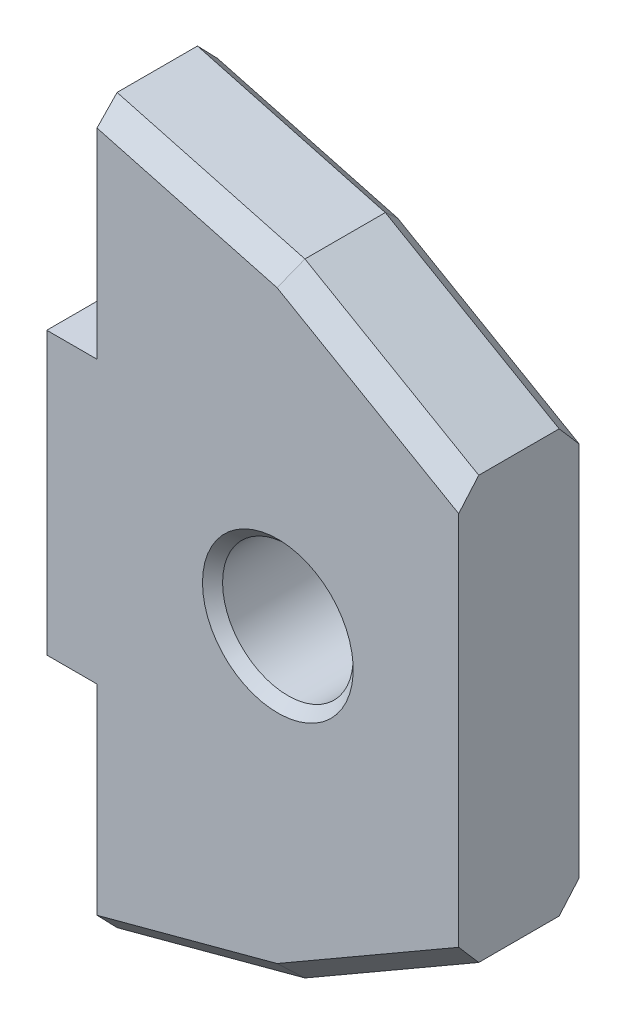
ISO-10303-21;
HEADER;
FILE_DESCRIPTION(('STEP AP214'),'2;1');
FILE_NAME('part.step','',(''),(''),'','','');
FILE_SCHEMA(('AUTOMOTIVE_DESIGN { 1 0 10303 214 1 1 1 1 }'));
ENDSEC;
DATA;
#1=APPLICATION_CONTEXT('core data for automotive mechanical design processes');
#2=APPLICATION_PROTOCOL_DEFINITION('international standard','automotive_design',2000,#1);
#3=PRODUCT_CONTEXT('',#1,'mechanical');
#4=PRODUCT('Part','Part','',(#3));
#5=PRODUCT_RELATED_PRODUCT_CATEGORY('part','',(#4));
#6=PRODUCT_DEFINITION_FORMATION('','',#4);
#7=PRODUCT_DEFINITION_CONTEXT('part definition',#1,'design');
#8=PRODUCT_DEFINITION('design','',#6,#7);
#9=PRODUCT_DEFINITION_SHAPE('','',#8);
#10=(LENGTH_UNIT() NAMED_UNIT(*) SI_UNIT(.MILLI.,.METRE.));
#11=(NAMED_UNIT(*) PLANE_ANGLE_UNIT() SI_UNIT($,.RADIAN.));
#12=(NAMED_UNIT(*) SI_UNIT($,.STERADIAN.) SOLID_ANGLE_UNIT());
#13=UNCERTAINTY_MEASURE_WITH_UNIT(LENGTH_MEASURE(1.E-05),#10,'distance_accuracy_value','');
#14=(GEOMETRIC_REPRESENTATION_CONTEXT(3) GLOBAL_UNCERTAINTY_ASSIGNED_CONTEXT((#13)) GLOBAL_UNIT_ASSIGNED_CONTEXT((#10,
#11,#12)) REPRESENTATION_CONTEXT('',''));
#15=CARTESIAN_POINT('',(0.,0.,0.));
#16=DIRECTION('',(0.,0.,1.));
#17=DIRECTION('',(1.,0.,0.));
#18=AXIS2_PLACEMENT_3D('',#15,#16,#17);
#19=CARTESIAN_POINT('',(-18.,14.,6.));
#20=DIRECTION('',(-1.,0.,0.));
#21=DIRECTION('',(0.,0.,1.));
#22=AXIS2_PLACEMENT_3D('',#19,#20,#21);
#23=PLANE('',#22);
#24=DIRECTION('',(0.,0.,-1.));
#25=VECTOR('',#24,1.);
#26=CARTESIAN_POINT('',(-18.,36.,6.));
#27=LINE('',#26,#25);
#28=CARTESIAN_POINT('',(-18.,36.,4.));
#29=VERTEX_POINT('',#28);
#30=CARTESIAN_POINT('',(-18.,36.,-3.99999999999997));
#31=VERTEX_POINT('',#30);
#32=EDGE_CURVE('E230',#29,#31,#27,.T.);
#33=ORIENTED_EDGE('',*,*,#32,.T.);
#34=DIRECTION('',(0.,0.719254596676402,0.694746590606868));
#35=VECTOR('',#34,1.);
#36=CARTESIAN_POINT('',(-18.,29.6157989417095,-10.1666646824248));
#37=LINE('',#36,#35);
#38=CARTESIAN_POINT('',(-18.,33.9294476391798,-6.));
#39=VERTEX_POINT('',#38);
#40=EDGE_CURVE('E309',#31,#39,#37,.F.);
#41=ORIENTED_EDGE('',*,*,#40,.T.);
#42=DIRECTION('',(0.,1.,0.));
#43=VECTOR('',#42,1.);
#44=CARTESIAN_POINT('',(-18.,14.,-6.));
#45=LINE('',#44,#43);
#46=CARTESIAN_POINT('',(-18.,14.,-6.));
#47=VERTEX_POINT('',#46);
#48=EDGE_CURVE('E231',#47,#39,#45,.T.);
#49=ORIENTED_EDGE('',*,*,#48,.F.);
#50=DIRECTION('',(0.,0.,-1.));
#51=VECTOR('',#50,1.);
#52=CARTESIAN_POINT('',(-18.,14.,6.));
#53=LINE('',#52,#51);
#54=CARTESIAN_POINT('',(-18.,14.,6.));
#55=VERTEX_POINT('',#54);
#56=EDGE_CURVE('E247',#55,#47,#53,.T.);
#57=ORIENTED_EDGE('',*,*,#56,.F.);
#58=DIRECTION('',(0.,1.,0.));
#59=VECTOR('',#58,1.);
#60=CARTESIAN_POINT('',(-18.,14.,6.));
#61=LINE('',#60,#59);
#62=CARTESIAN_POINT('',(-18.,33.9294476391798,6.));
#63=VERTEX_POINT('',#62);
#64=EDGE_CURVE('E222',#55,#63,#61,.T.);
#65=ORIENTED_EDGE('',*,*,#64,.T.);
#66=DIRECTION('',(0.,0.719254596676405,-0.694746590606864));
#67=VECTOR('',#66,1.);
#68=CARTESIAN_POINT('',(-18.,23.6194027958785,15.9587385843432));
#69=LINE('',#68,#67);
#70=EDGE_CURVE('E307',#63,#29,#69,.T.);
#71=ORIENTED_EDGE('',*,*,#70,.T.);
#72=EDGE_LOOP('',(#33,#41,#49,#57,#65,#71));
#73=FACE_BOUND('',#72,.T.);
#74=ADVANCED_FACE('F76',(#73),#23,.T.);
#75=CARTESIAN_POINT('',(-23.,14.,6.));
#76=DIRECTION('',(0.,1.,0.));
#77=DIRECTION('',(0.,0.,1.));
#78=AXIS2_PLACEMENT_3D('',#75,#76,#77);
#79=PLANE('',#78);
#80=DIRECTION('',(1.,0.,0.));
#81=VECTOR('',#80,1.);
#82=CARTESIAN_POINT('',(-23.,14.,-6.));
#83=LINE('',#82,#81);
#84=CARTESIAN_POINT('',(-23.,14.,-6.));
#85=VERTEX_POINT('',#84);
#86=EDGE_CURVE('E244',#85,#47,#83,.T.);
#87=ORIENTED_EDGE('',*,*,#86,.F.);
#88=DIRECTION('',(0.,0.,-1.));
#89=VECTOR('',#88,1.);
#90=CARTESIAN_POINT('',(-23.,14.,6.));
#91=LINE('',#90,#89);
#92=CARTESIAN_POINT('',(-23.,14.,6.));
#93=VERTEX_POINT('',#92);
#94=EDGE_CURVE('E250',#93,#85,#91,.T.);
#95=ORIENTED_EDGE('',*,*,#94,.F.);
#96=DIRECTION('',(1.,0.,0.));
#97=VECTOR('',#96,1.);
#98=CARTESIAN_POINT('',(-23.,14.,6.));
#99=LINE('',#98,#97);
#100=EDGE_CURVE('E227',#93,#55,#99,.T.);
#101=ORIENTED_EDGE('',*,*,#100,.T.);
#102=ORIENTED_EDGE('',*,*,#56,.T.);
#103=EDGE_LOOP('',(#87,#95,#101,#102));
#104=FACE_BOUND('',#103,.T.);
#105=ADVANCED_FACE('F365',(#104),#79,.T.);
#106=CARTESIAN_POINT('',(-23.,-14.,6.));
#107=DIRECTION('',(-1.,0.,0.));
#108=DIRECTION('',(0.,0.,1.));
#109=AXIS2_PLACEMENT_3D('',#106,#107,#108);
#110=PLANE('',#109);
#111=DIRECTION('',(0.,1.,0.));
#112=VECTOR('',#111,1.);
#113=CARTESIAN_POINT('',(-23.,-14.,-6.));
#114=LINE('',#113,#112);
#115=CARTESIAN_POINT('',(-23.,-14.,-6.));
#116=VERTEX_POINT('',#115);
#117=EDGE_CURVE('E241',#116,#85,#114,.T.);
#118=ORIENTED_EDGE('',*,*,#117,.F.);
#119=DIRECTION('',(0.,0.,-1.));
#120=VECTOR('',#119,1.);
#121=CARTESIAN_POINT('',(-23.,-14.,6.));
#122=LINE('',#121,#120);
#123=CARTESIAN_POINT('',(-23.,-14.,6.));
#124=VERTEX_POINT('',#123);
#125=EDGE_CURVE('E212',#124,#116,#122,.T.);
#126=ORIENTED_EDGE('',*,*,#125,.F.);
#127=DIRECTION('',(0.,1.,0.));
#128=VECTOR('',#127,1.);
#129=CARTESIAN_POINT('',(-23.,-14.,6.));
#130=LINE('',#129,#128);
#131=EDGE_CURVE('E201',#124,#93,#130,.T.);
#132=ORIENTED_EDGE('',*,*,#131,.T.);
#133=ORIENTED_EDGE('',*,*,#94,.T.);
#134=EDGE_LOOP('',(#118,#126,#132,#133));
#135=FACE_BOUND('',#134,.T.);
#136=ADVANCED_FACE('F373',(#135),#110,.T.);
#137=CARTESIAN_POINT('',(-23.,-14.,6.));
#138=DIRECTION('',(0.,1.,0.));
#139=DIRECTION('',(0.,0.,1.));
#140=AXIS2_PLACEMENT_3D('',#137,#138,#139);
#141=PLANE('',#140);
#142=DIRECTION('',(1.,0.,0.));
#143=VECTOR('',#142,1.);
#144=CARTESIAN_POINT('',(-23.,-14.,-6.));
#145=LINE('',#144,#143);
#146=CARTESIAN_POINT('',(-18.,-14.,-6.));
#147=VERTEX_POINT('',#146);
#148=EDGE_CURVE('E208',#116,#147,#145,.T.);
#149=ORIENTED_EDGE('',*,*,#148,.T.);
#150=DIRECTION('',(0.,0.,-1.));
#151=VECTOR('',#150,1.);
#152=CARTESIAN_POINT('',(-18.,-14.,6.));
#153=LINE('',#152,#151);
#154=CARTESIAN_POINT('',(-18.,-14.,6.));
#155=VERTEX_POINT('',#154);
#156=EDGE_CURVE('E205',#155,#147,#153,.T.);
#157=ORIENTED_EDGE('',*,*,#156,.F.);
#158=DIRECTION('',(1.,0.,0.));
#159=VECTOR('',#158,1.);
#160=CARTESIAN_POINT('',(-23.,-14.,6.));
#161=LINE('',#160,#159);
#162=EDGE_CURVE('E193',#124,#155,#161,.T.);
#163=ORIENTED_EDGE('',*,*,#162,.F.);
#164=ORIENTED_EDGE('',*,*,#125,.T.);
#165=EDGE_LOOP('',(#149,#157,#163,#164));
#166=FACE_BOUND('',#165,.T.);
#167=ADVANCED_FACE('F206',(#166),#141,.F.);
#168=CARTESIAN_POINT('',(-18.,-14.,6.));
#169=DIRECTION('',(1.,0.,0.));
#170=DIRECTION('',(0.,1.,0.));
#171=AXIS2_PLACEMENT_3D('',#168,#169,#170);
#172=PLANE('',#171);
#173=DIRECTION('',(0.,-1.,0.));
#174=VECTOR('',#173,1.);
#175=CARTESIAN_POINT('',(-18.,-14.,-6.));
#176=LINE('',#175,#174);
#177=CARTESIAN_POINT('',(-18.,-33.9294476391798,-6.));
#178=VERTEX_POINT('',#177);
#179=EDGE_CURVE('E238',#147,#178,#176,.T.);
#180=ORIENTED_EDGE('',*,*,#179,.T.);
#181=DIRECTION('',(0.,-0.719254596676405,0.694746590606865));
#182=VECTOR('',#181,1.);
#183=CARTESIAN_POINT('',(-18.,-36.,-4.));
#184=LINE('',#183,#182);
#185=CARTESIAN_POINT('',(-18.,-36.,-4.));
#186=VERTEX_POINT('',#185);
#187=EDGE_CURVE('E293',#178,#186,#184,.T.);
#188=ORIENTED_EDGE('',*,*,#187,.T.);
#189=DIRECTION('',(0.,0.,-1.));
#190=VECTOR('',#189,1.);
#191=CARTESIAN_POINT('',(-18.,-36.,6.));
#192=LINE('',#191,#190);
#193=CARTESIAN_POINT('',(-18.,-36.,3.99999999999998));
#194=VERTEX_POINT('',#193);
#195=EDGE_CURVE('E213',#194,#186,#192,.T.);
#196=ORIENTED_EDGE('',*,*,#195,.F.);
#197=DIRECTION('',(0.,-0.719254596676402,-0.694746590606867));
#198=VECTOR('',#197,1.);
#199=CARTESIAN_POINT('',(-18.,-30.4256724094527,9.38438698390534));
#200=LINE('',#199,#198);
#201=CARTESIAN_POINT('',(-18.,-33.9294476391798,6.));
#202=VERTEX_POINT('',#201);
#203=EDGE_CURVE('E218',#194,#202,#200,.F.);
#204=ORIENTED_EDGE('',*,*,#203,.T.);
#205=DIRECTION('',(0.,-1.,0.));
#206=VECTOR('',#205,1.);
#207=CARTESIAN_POINT('',(-18.,-14.,6.));
#208=LINE('',#207,#206);
#209=EDGE_CURVE('E197',#155,#202,#208,.T.);
#210=ORIENTED_EDGE('',*,*,#209,.F.);
#211=ORIENTED_EDGE('',*,*,#156,.T.);
#212=EDGE_LOOP('',(#180,#188,#196,#204,#210,#211));
#213=FACE_BOUND('',#212,.T.);
#214=ADVANCED_FACE('F215',(#213),#172,.F.);
#215=CARTESIAN_POINT('',(-18.,-36.,6.));
#216=DIRECTION('',(-0.258819045102514,0.96592582628907,0.));
#217=DIRECTION('',(-0.96592582628907,-0.258819045102514,0.));
#218=AXIS2_PLACEMENT_3D('',#215,#216,#217);
#219=PLANE('',#218);
#220=ORIENTED_EDGE('',*,*,#195,.T.);
#221=DIRECTION('',(0.96592582628907,0.258819045102514,0.));
#222=VECTOR('',#221,1.);
#223=CARTESIAN_POINT('',(0.696152422705765,-30.9903810567669,-4.));
#224=LINE('',#223,#222);
#225=CARTESIAN_POINT('',(0.696152422705765,-30.9903810567669,-4.));
#226=VERTEX_POINT('',#225);
#227=EDGE_CURVE('E290',#186,#226,#224,.T.);
#228=ORIENTED_EDGE('',*,*,#227,.T.);
#229=DIRECTION('',(0.,0.,-1.));
#230=VECTOR('',#229,1.);
#231=CARTESIAN_POINT('',(0.696152422705765,-30.9903810567669,6.));
#232=LINE('',#231,#230);
#233=CARTESIAN_POINT('',(0.696152422705765,-30.9903810567669,3.99999999999998));
#234=VERTEX_POINT('',#233);
#235=EDGE_CURVE('E255',#234,#226,#232,.T.);
#236=ORIENTED_EDGE('',*,*,#235,.F.);
#237=DIRECTION('',(-0.96592582628907,-0.258819045102514,0.));
#238=VECTOR('',#237,1.);
#239=CARTESIAN_POINT('',(-18.,-36.,3.99999999999998));
#240=LINE('',#239,#238);
#241=EDGE_CURVE('E288',#234,#194,#240,.T.);
#242=ORIENTED_EDGE('',*,*,#241,.T.);
#243=EDGE_LOOP('',(#220,#228,#236,#242));
#244=FACE_BOUND('',#243,.T.);
#245=ADVANCED_FACE('F460',(#244),#219,.F.);
#246=CARTESIAN_POINT('',(0.696152422705765,-30.9903810567669,6.));
#247=DIRECTION('',(-0.499999999999995,0.866025403784441,0.));
#248=DIRECTION('',(-0.866025403784442,-0.499999999999995,0.));
#249=AXIS2_PLACEMENT_3D('',#246,#247,#248);
#250=PLANE('',#249);
#251=ORIENTED_EDGE('',*,*,#235,.T.);
#252=DIRECTION('',(0.866025403784442,0.499999999999995,0.));
#253=VECTOR('',#252,1.);
#254=CARTESIAN_POINT('',(18.,-21.,-4.));
#255=LINE('',#254,#253);
#256=CARTESIAN_POINT('',(18.,-21.,-4.));
#257=VERTEX_POINT('',#256);
#258=EDGE_CURVE('E268',#226,#257,#255,.T.);
#259=ORIENTED_EDGE('',*,*,#258,.T.);
#260=DIRECTION('',(0.,0.,-1.));
#261=VECTOR('',#260,1.);
#262=CARTESIAN_POINT('',(18.,-21.,6.));
#263=LINE('',#262,#261);
#264=CARTESIAN_POINT('',(18.,-21.,3.99999999999999));
#265=VERTEX_POINT('',#264);
#266=EDGE_CURVE('E258',#265,#257,#263,.T.);
#267=ORIENTED_EDGE('',*,*,#266,.F.);
#268=DIRECTION('',(-0.866025403784442,-0.499999999999995,0.));
#269=VECTOR('',#268,1.);
#270=CARTESIAN_POINT('',(0.696152422705765,-30.9903810567669,3.99999999999999));
#271=LINE('',#270,#269);
#272=EDGE_CURVE('E249',#265,#234,#271,.T.);
#273=ORIENTED_EDGE('',*,*,#272,.T.);
#274=EDGE_LOOP('',(#251,#259,#267,#273));
#275=FACE_BOUND('',#274,.T.);
#276=ADVANCED_FACE('F463',(#275),#250,.F.);
#277=CARTESIAN_POINT('',(18.,21.,6.));
#278=DIRECTION('',(1.,0.,0.));
#279=DIRECTION('',(0.,1.,0.));
#280=AXIS2_PLACEMENT_3D('',#277,#278,#279);
#281=PLANE('',#280);
#282=ORIENTED_EDGE('',*,*,#266,.T.);
#283=DIRECTION('',(0.,0.755928946018455,-0.654653670707976));
#284=VECTOR('',#283,1.);
#285=CARTESIAN_POINT('',(18.,-1.94871659305388,-20.4988954051122));
#286=LINE('',#285,#284);
#287=CARTESIAN_POINT('',(18.,-18.6905989232415,-6.));
#288=VERTEX_POINT('',#287);
#289=EDGE_CURVE('E277',#257,#288,#286,.T.);
#290=ORIENTED_EDGE('',*,*,#289,.T.);
#291=DIRECTION('',(0.,-1.,0.));
#292=VECTOR('',#291,1.);
#293=CARTESIAN_POINT('',(18.,21.,-6.));
#294=LINE('',#293,#292);
#295=CARTESIAN_POINT('',(18.,18.6905989232415,-6.));
#296=VERTEX_POINT('',#295);
#297=EDGE_CURVE('E234',#296,#288,#294,.T.);
#298=ORIENTED_EDGE('',*,*,#297,.F.);
#299=DIRECTION('',(0.,-0.755928946018451,-0.654653670707981));
#300=VECTOR('',#299,1.);
#301=CARTESIAN_POINT('',(18.,25.9487165930539,0.285714285714355));
#302=LINE('',#301,#300);
#303=CARTESIAN_POINT('',(18.,21.,-3.99999999999997));
#304=VERTEX_POINT('',#303);
#305=EDGE_CURVE('E273',#296,#304,#302,.F.);
#306=ORIENTED_EDGE('',*,*,#305,.T.);
#307=DIRECTION('',(0.,0.,-1.));
#308=VECTOR('',#307,1.);
#309=CARTESIAN_POINT('',(18.,21.,6.));
#310=LINE('',#309,#308);
#311=CARTESIAN_POINT('',(18.,21.,4.));
#312=VERTEX_POINT('',#311);
#313=EDGE_CURVE('E261',#312,#304,#310,.T.);
#314=ORIENTED_EDGE('',*,*,#313,.F.);
#315=DIRECTION('',(0.,-0.755928946018456,0.654653670707976));
#316=VECTOR('',#315,1.);
#317=CARTESIAN_POINT('',(18.,20.0102566813892,4.85714285714285));
#318=LINE('',#317,#316);
#319=CARTESIAN_POINT('',(18.,18.6905989232415,6.));
#320=VERTEX_POINT('',#319);
#321=EDGE_CURVE('E271',#312,#320,#318,.T.);
#322=ORIENTED_EDGE('',*,*,#321,.T.);
#323=DIRECTION('',(0.,-1.,0.));
#324=VECTOR('',#323,1.);
#325=CARTESIAN_POINT('',(18.,21.,6.));
#326=LINE('',#325,#324);
#327=CARTESIAN_POINT('',(18.,-18.6905989232415,6.));
#328=VERTEX_POINT('',#327);
#329=EDGE_CURVE('E219',#320,#328,#326,.T.);
#330=ORIENTED_EDGE('',*,*,#329,.T.);
#331=DIRECTION('',(0.,0.755928946018453,0.654653670707979));
#332=VECTOR('',#331,1.);
#333=CARTESIAN_POINT('',(18.,3.98974331861071,25.6417525479694));
#334=LINE('',#333,#332);
#335=EDGE_CURVE('E275',#328,#265,#334,.F.);
#336=ORIENTED_EDGE('',*,*,#335,.T.);
#337=EDGE_LOOP('',(#282,#290,#298,#306,#314,#322,#330,#336));
#338=FACE_BOUND('',#337,.T.);
#339=ADVANCED_FACE('F471',(#338),#281,.T.);
#340=CARTESIAN_POINT('',(0.696152422705758,30.9903810567669,6.));
#341=DIRECTION('',(0.499999999999995,0.866025403784442,0.));
#342=DIRECTION('',(-0.866025403784442,0.499999999999995,0.));
#343=AXIS2_PLACEMENT_3D('',#340,#341,#342);
#344=PLANE('',#343);
#345=ORIENTED_EDGE('',*,*,#313,.T.);
#346=DIRECTION('',(-0.866025403784442,0.499999999999995,0.));
#347=VECTOR('',#346,1.);
#348=CARTESIAN_POINT('',(0.696152422705758,30.9903810567669,-3.99999999999997));
#349=LINE('',#348,#347);
#350=CARTESIAN_POINT('',(0.696152422705758,30.9903810567669,-3.99999999999997));
#351=VERTEX_POINT('',#350);
#352=EDGE_CURVE('E92',#304,#351,#349,.T.);
#353=ORIENTED_EDGE('',*,*,#352,.T.);
#354=DIRECTION('',(0.,0.,-1.));
#355=VECTOR('',#354,1.);
#356=CARTESIAN_POINT('',(0.696152422705758,30.9903810567669,6.));
#357=LINE('',#356,#355);
#358=CARTESIAN_POINT('',(0.696152422705758,30.9903810567669,4.));
#359=VERTEX_POINT('',#358);
#360=EDGE_CURVE('E263',#359,#351,#357,.T.);
#361=ORIENTED_EDGE('',*,*,#360,.F.);
#362=DIRECTION('',(0.866025403784442,-0.499999999999995,0.));
#363=VECTOR('',#362,1.);
#364=CARTESIAN_POINT('',(18.,21.,4.));
#365=LINE('',#364,#363);
#366=EDGE_CURVE('E311',#359,#312,#365,.T.);
#367=ORIENTED_EDGE('',*,*,#366,.T.);
#368=EDGE_LOOP('',(#345,#353,#361,#367));
#369=FACE_BOUND('',#368,.T.);
#370=ADVANCED_FACE('F362',(#369),#344,.T.);
#371=CARTESIAN_POINT('',(-18.,36.,6.));
#372=DIRECTION('',(0.258819045102514,0.96592582628907,0.));
#373=DIRECTION('',(-0.96592582628907,0.258819045102514,0.));
#374=AXIS2_PLACEMENT_3D('',#371,#372,#373);
#375=PLANE('',#374);
#376=ORIENTED_EDGE('',*,*,#360,.T.);
#377=DIRECTION('',(-0.96592582628907,0.258819045102514,0.));
#378=VECTOR('',#377,1.);
#379=CARTESIAN_POINT('',(-18.,36.,-3.99999999999997));
#380=LINE('',#379,#378);
#381=EDGE_CURVE('E305',#351,#31,#380,.T.);
#382=ORIENTED_EDGE('',*,*,#381,.T.);
#383=ORIENTED_EDGE('',*,*,#32,.F.);
#384=DIRECTION('',(0.96592582628907,-0.258819045102514,0.));
#385=VECTOR('',#384,1.);
#386=CARTESIAN_POINT('',(0.696152422705758,30.9903810567669,4.));
#387=LINE('',#386,#385);
#388=EDGE_CURVE('E99',#29,#359,#387,.T.);
#389=ORIENTED_EDGE('',*,*,#388,.T.);
#390=EDGE_LOOP('',(#376,#382,#383,#389));
#391=FACE_BOUND('',#390,.T.);
#392=ADVANCED_FACE('F354',(#391),#375,.T.);
#393=CARTESIAN_POINT('',(0.,0.,6.));
#394=DIRECTION('',(0.,0.,-1.));
#395=DIRECTION('',(-1.,0.,0.));
#396=AXIS2_PLACEMENT_3D('',#393,#394,#395);
#397=PLANE('',#396);
#398=CARTESIAN_POINT('',(0.,0.,6.));
#399=DIRECTION('',(0.,0.,-1.));
#400=DIRECTION('',(-1.,0.,0.));
#401=AXIS2_PLACEMENT_3D('',#398,#399,#400);
#402=CIRCLE('',#401,7.5);
#403=CARTESIAN_POINT('',(-7.5,0.,6.));
#404=VERTEX_POINT('',#403);
#405=EDGE_CURVE('E12',#404,#404,#402,.T.);
#406=ORIENTED_EDGE('',*,*,#405,.T.);
#407=EDGE_LOOP('',(#406));
#408=FACE_BOUND('',#407,.T.);
#409=DIRECTION('',(0.96592582628907,0.258819045102514,0.));
#410=VECTOR('',#409,1.);
#411=CARTESIAN_POINT('',(7.27659054385477,-27.156605615542,6.));
#412=LINE('',#411,#410);
#413=CARTESIAN_POINT('',(-0.0758187625295246,-29.1266777516107,6.));
#414=VERTEX_POINT('',#413);
#415=EDGE_CURVE('E299',#202,#414,#412,.T.);
#416=ORIENTED_EDGE('',*,*,#415,.T.);
#417=DIRECTION('',(0.866025403784442,0.499999999999995,0.));
#418=VECTOR('',#417,1.);
#419=CARTESIAN_POINT('',(12.5932667397365,-21.8121778264911,6.));
#420=LINE('',#419,#418);
#421=EDGE_CURVE('E301',#414,#328,#420,.T.);
#422=ORIENTED_EDGE('',*,*,#421,.T.);
#423=ORIENTED_EDGE('',*,*,#329,.F.);
#424=DIRECTION('',(-0.866025403784442,0.499999999999995,0.));
#425=VECTOR('',#424,1.);
#426=CARTESIAN_POINT('',(-0.303847577294239,29.258330249198,6.));
#427=LINE('',#426,#425);
#428=CARTESIAN_POINT('',(-0.0758187625295215,29.1266777516107,6.));
#429=VERTEX_POINT('',#428);
#430=EDGE_CURVE('E297',#320,#429,#427,.T.);
#431=ORIENTED_EDGE('',*,*,#430,.T.);
#432=DIRECTION('',(-0.96592582628907,0.258819045102514,0.));
#433=VECTOR('',#432,1.);
#434=CARTESIAN_POINT('',(-18.517638090205,34.0681483474218,6.));
#435=LINE('',#434,#433);
#436=EDGE_CURVE('E295',#429,#63,#435,.T.);
#437=ORIENTED_EDGE('',*,*,#436,.T.);
#438=ORIENTED_EDGE('',*,*,#64,.F.);
#439=ORIENTED_EDGE('',*,*,#100,.F.);
#440=ORIENTED_EDGE('',*,*,#131,.F.);
#441=ORIENTED_EDGE('',*,*,#162,.T.);
#442=ORIENTED_EDGE('',*,*,#209,.T.);
#443=EDGE_LOOP('',(#416,#422,#423,#431,#437,#438,#439,#440,#441,#442));
#444=FACE_BOUND('',#443,.T.);
#445=ADVANCED_FACE('F195',(#408,#444),#397,.F.);
#446=CARTESIAN_POINT('',(0.,0.,-6.));
#447=DIRECTION('',(0.,0.,-1.));
#448=DIRECTION('',(-1.,0.,0.));
#449=AXIS2_PLACEMENT_3D('',#446,#447,#448);
#450=PLANE('',#449);
#451=CARTESIAN_POINT('',(0.,0.,-6.));
#452=DIRECTION('',(0.,0.,-1.));
#453=DIRECTION('',(-1.,0.,0.));
#454=AXIS2_PLACEMENT_3D('',#451,#452,#453);
#455=CIRCLE('',#454,7.5);
#456=CARTESIAN_POINT('',(-7.5,0.,-6.));
#457=VERTEX_POINT('',#456);
#458=EDGE_CURVE('E85',#457,#457,#455,.F.);
#459=ORIENTED_EDGE('',*,*,#458,.T.);
#460=EDGE_LOOP('',(#459));
#461=FACE_BOUND('',#460,.T.);
#462=ORIENTED_EDGE('',*,*,#297,.T.);
#463=DIRECTION('',(-0.866025403784442,-0.499999999999995,0.));
#464=VECTOR('',#463,1.);
#465=CARTESIAN_POINT('',(-0.303847577294232,-29.258330249198,-6.));
#466=LINE('',#465,#464);
#467=CARTESIAN_POINT('',(-0.0758187625295366,-29.1266777516107,-6.));
#468=VERTEX_POINT('',#467);
#469=EDGE_CURVE('E286',#288,#468,#466,.T.);
#470=ORIENTED_EDGE('',*,*,#469,.T.);
#471=DIRECTION('',(-0.96592582628907,-0.258819045102514,0.));
#472=VECTOR('',#471,1.);
#473=CARTESIAN_POINT('',(-18.517638090205,-34.0681483474218,-6.));
#474=LINE('',#473,#472);
#475=EDGE_CURVE('E284',#468,#178,#474,.T.);
#476=ORIENTED_EDGE('',*,*,#475,.T.);
#477=ORIENTED_EDGE('',*,*,#179,.F.);
#478=ORIENTED_EDGE('',*,*,#148,.F.);
#479=ORIENTED_EDGE('',*,*,#117,.T.);
#480=ORIENTED_EDGE('',*,*,#86,.T.);
#481=ORIENTED_EDGE('',*,*,#48,.T.);
#482=DIRECTION('',(0.96592582628907,-0.258819045102514,0.));
#483=VECTOR('',#482,1.);
#484=CARTESIAN_POINT('',(7.27659054385476,27.156605615542,-6.));
#485=LINE('',#484,#483);
#486=CARTESIAN_POINT('',(-0.0758187625295076,29.1266777516106,-6.));
#487=VERTEX_POINT('',#486);
#488=EDGE_CURVE('E281',#39,#487,#485,.T.);
#489=ORIENTED_EDGE('',*,*,#488,.T.);
#490=DIRECTION('',(0.866025403784442,-0.499999999999995,0.));
#491=VECTOR('',#490,1.);
#492=CARTESIAN_POINT('',(12.5932667397364,21.8121778264911,-6.));
#493=LINE('',#492,#491);
#494=EDGE_CURVE('E279',#487,#296,#493,.T.);
#495=ORIENTED_EDGE('',*,*,#494,.T.);
#496=EDGE_LOOP('',(#462,#470,#476,#477,#478,#479,#480,#481,#489,#495));
#497=FACE_BOUND('',#496,.T.);
#498=ADVANCED_FACE('F333',(#461,#497),#450,.T.);
#499=CARTESIAN_POINT('',(0.,0.,6.));
#500=DIRECTION('',(0.,0.,-1.));
#501=DIRECTION('',(-1.,0.,0.));
#502=AXIS2_PLACEMENT_3D('',#499,#500,#501);
#503=CYLINDRICAL_SURFACE('',#502,6.5);
#504=CARTESIAN_POINT('',(0.,0.,-4.99999999999999));
#505=DIRECTION('',(0.,0.,-1.));
#506=DIRECTION('',(-1.,0.,0.));
#507=AXIS2_PLACEMENT_3D('',#504,#505,#506);
#508=CIRCLE('',#507,6.5);
#509=CARTESIAN_POINT('',(-6.5,0.,-4.99999999999999));
#510=VERTEX_POINT('',#509);
#511=EDGE_CURVE('E328',#510,#510,#508,.T.);
#512=ORIENTED_EDGE('',*,*,#511,.T.);
#513=EDGE_LOOP('',(#512));
#514=FACE_BOUND('',#513,.T.);
#515=CARTESIAN_POINT('',(0.,0.,5.));
#516=DIRECTION('',(0.,0.,-1.));
#517=DIRECTION('',(-1.,0.,0.));
#518=AXIS2_PLACEMENT_3D('',#515,#516,#517);
#519=CIRCLE('',#518,6.5);
#520=CARTESIAN_POINT('',(-6.5,0.,5.));
#521=VERTEX_POINT('',#520);
#522=EDGE_CURVE('E315',#521,#521,#519,.F.);
#523=ORIENTED_EDGE('',*,*,#522,.T.);
#524=EDGE_LOOP('',(#523));
#525=FACE_BOUND('',#524,.T.);
#526=ADVANCED_FACE('F342',(#514,#525),#503,.F.);
#527=CARTESIAN_POINT('',(-18.,-36.,-4.));
#528=DIRECTION('',(0.183012701892214,-0.683012701892219,-0.707106781186549));
#529=DIRECTION('',(-0.96592582628907,-0.258819045102514,0.));
#530=AXIS2_PLACEMENT_3D('',#527,#528,#529);
#531=PLANE('',#530);
#532=ORIENTED_EDGE('',*,*,#187,.F.);
#533=ORIENTED_EDGE('',*,*,#475,.F.);
#534=DIRECTION('',(0.271758016897811,-0.656081890078318,0.704062592219635));
#535=VECTOR('',#534,1.);
#536=CARTESIAN_POINT('',(0.208588907580274,-29.8132986060327,-5.26316506224747));
#537=LINE('',#536,#535);
#538=EDGE_CURVE('E235',#226,#468,#537,.F.);
#539=ORIENTED_EDGE('',*,*,#538,.F.);
#540=ORIENTED_EDGE('',*,*,#227,.F.);
#541=EDGE_LOOP('',(#532,#533,#539,#540));
#542=FACE_BOUND('',#541,.T.);
#543=ADVANCED_FACE('F345',(#542),#531,.T.);
#544=CARTESIAN_POINT('',(0.696152422705765,-30.9903810567669,-4.));
#545=DIRECTION('',(0.353553390593269,-0.612372435695795,-0.70710678118655));
#546=DIRECTION('',(-0.866025403784442,-0.499999999999995,0.));
#547=AXIS2_PLACEMENT_3D('',#544,#545,#546);
#548=PLANE('',#547);
#549=ORIENTED_EDGE('',*,*,#538,.T.);
#550=ORIENTED_EDGE('',*,*,#469,.F.);
#551=ORIENTED_EDGE('',*,*,#289,.F.);
#552=ORIENTED_EDGE('',*,*,#258,.F.);
#553=EDGE_LOOP('',(#549,#550,#551,#552));
#554=FACE_BOUND('',#553,.T.);
#555=ADVANCED_FACE('F379',(#554),#548,.T.);
#556=CARTESIAN_POINT('',(7.27659054385477,-27.156605615542,6.));
#557=DIRECTION('',(-0.183012701892215,0.683012701892221,-0.707106781186547));
#558=DIRECTION('',(0.96592582628907,0.258819045102514,0.));
#559=AXIS2_PLACEMENT_3D('',#556,#557,#558);
#560=PLANE('',#559);
#561=ORIENTED_EDGE('',*,*,#203,.F.);
#562=ORIENTED_EDGE('',*,*,#241,.F.);
#563=DIRECTION('',(-0.271758016897809,0.656081890078316,0.704062592219637));
#564=VECTOR('',#563,1.);
#565=CARTESIAN_POINT('',(0.115919432849578,-29.5895747033198,5.50325038279594));
#566=LINE('',#565,#564);
#567=EDGE_CURVE('E318',#414,#234,#566,.F.);
#568=ORIENTED_EDGE('',*,*,#567,.F.);
#569=ORIENTED_EDGE('',*,*,#415,.F.);
#570=EDGE_LOOP('',(#561,#562,#568,#569));
#571=FACE_BOUND('',#570,.T.);
#572=ADVANCED_FACE('F386',(#571),#560,.F.);
#573=CARTESIAN_POINT('',(12.5932667397365,-21.8121778264911,6.));
#574=DIRECTION('',(-0.35355339059327,0.612372435695797,-0.707106781186547));
#575=DIRECTION('',(0.866025403784442,0.499999999999995,0.));
#576=AXIS2_PLACEMENT_3D('',#573,#574,#575);
#577=PLANE('',#576);
#578=ORIENTED_EDGE('',*,*,#567,.T.);
#579=ORIENTED_EDGE('',*,*,#272,.F.);
#580=ORIENTED_EDGE('',*,*,#335,.F.);
#581=ORIENTED_EDGE('',*,*,#421,.F.);
#582=EDGE_LOOP('',(#578,#579,#580,#581));
#583=FACE_BOUND('',#582,.T.);
#584=ADVANCED_FACE('F394',(#583),#577,.F.);
#585=CARTESIAN_POINT('',(12.5932667397364,21.8121778264911,-6.));
#586=DIRECTION('',(-0.353553390593271,-0.612372435695799,0.707106781186545));
#587=DIRECTION('',(0.866025403784442,-0.499999999999995,0.));
#588=AXIS2_PLACEMENT_3D('',#585,#586,#587);
#589=PLANE('',#588);
#590=ORIENTED_EDGE('',*,*,#305,.F.);
#591=ORIENTED_EDGE('',*,*,#494,.F.);
#592=DIRECTION('',(0.271758016897799,0.656081890078319,0.704062592219638));
#593=VECTOR('',#592,1.);
#594=CARTESIAN_POINT('',(-0.444318661385813,28.2370402980586,-6.95469858436234));
#595=LINE('',#594,#593);
#596=EDGE_CURVE('E321',#351,#487,#595,.F.);
#597=ORIENTED_EDGE('',*,*,#596,.F.);
#598=ORIENTED_EDGE('',*,*,#352,.F.);
#599=EDGE_LOOP('',(#590,#591,#597,#598));
#600=FACE_BOUND('',#599,.T.);
#601=ADVANCED_FACE('F400',(#600),#589,.F.);
#602=CARTESIAN_POINT('',(7.27659054385476,27.156605615542,-6.));
#603=DIRECTION('',(-0.183012701892215,-0.683012701892222,0.707106781186546));
#604=DIRECTION('',(0.96592582628907,-0.258819045102514,0.));
#605=AXIS2_PLACEMENT_3D('',#602,#603,#604);
#606=PLANE('',#605);
#607=ORIENTED_EDGE('',*,*,#40,.F.);
#608=ORIENTED_EDGE('',*,*,#381,.F.);
#609=ORIENTED_EDGE('',*,*,#596,.T.);
#610=ORIENTED_EDGE('',*,*,#488,.F.);
#611=EDGE_LOOP('',(#607,#608,#609,#610));
#612=FACE_BOUND('',#611,.T.);
#613=ADVANCED_FACE('F408',(#612),#606,.F.);
#614=CARTESIAN_POINT('',(-18.,36.,4.));
#615=DIRECTION('',(0.183012701892214,0.683012701892218,0.70710678118655));
#616=DIRECTION('',(-0.96592582628907,0.258819045102514,0.));
#617=AXIS2_PLACEMENT_3D('',#614,#615,#616);
#618=PLANE('',#617);
#619=ORIENTED_EDGE('',*,*,#70,.F.);
#620=ORIENTED_EDGE('',*,*,#436,.F.);
#621=DIRECTION('',(0.27175801689781,0.656081890078318,-0.704062592219634));
#622=VECTOR('',#621,1.);
#623=CARTESIAN_POINT('',(0.208588907580267,29.8132986060327,5.26316506224746));
#624=LINE('',#623,#622);
#625=EDGE_CURVE('E323',#359,#429,#624,.F.);
#626=ORIENTED_EDGE('',*,*,#625,.F.);
#627=ORIENTED_EDGE('',*,*,#388,.F.);
#628=EDGE_LOOP('',(#619,#620,#626,#627));
#629=FACE_BOUND('',#628,.T.);
#630=ADVANCED_FACE('F414',(#629),#618,.T.);
#631=CARTESIAN_POINT('',(0.696152422705758,30.9903810567669,4.));
#632=DIRECTION('',(0.353553390593269,0.612372435695795,0.70710678118655));
#633=DIRECTION('',(-0.866025403784442,0.499999999999995,0.));
#634=AXIS2_PLACEMENT_3D('',#631,#632,#633);
#635=PLANE('',#634);
#636=ORIENTED_EDGE('',*,*,#625,.T.);
#637=ORIENTED_EDGE('',*,*,#430,.F.);
#638=ORIENTED_EDGE('',*,*,#321,.F.);
#639=ORIENTED_EDGE('',*,*,#366,.F.);
#640=EDGE_LOOP('',(#636,#637,#638,#639));
#641=FACE_BOUND('',#640,.T.);
#642=ADVANCED_FACE('F339',(#641),#635,.T.);
#643=CARTESIAN_POINT('',(0.,0.,-4.99999999999999));
#644=DIRECTION('',(0.,0.,-1.));
#645=DIRECTION('',(-1.,0.,0.));
#646=AXIS2_PLACEMENT_3D('',#643,#644,#645);
#647=CONICAL_SURFACE('',#646,6.5,0.785398163397444);
#648=ORIENTED_EDGE('',*,*,#458,.F.);
#649=EDGE_LOOP('',(#648));
#650=FACE_BOUND('',#649,.T.);
#651=ORIENTED_EDGE('',*,*,#511,.F.);
#652=EDGE_LOOP('',(#651));
#653=FACE_BOUND('',#652,.T.);
#654=ADVANCED_FACE('F336',(#650,#653),#647,.F.);
#655=CARTESIAN_POINT('',(0.,0.,6.));
#656=DIRECTION('',(0.,0.,1.));
#657=DIRECTION('',(1.,0.,0.));
#658=AXIS2_PLACEMENT_3D('',#655,#656,#657);
#659=CONICAL_SURFACE('',#658,7.5,0.785398163397449);
#660=ORIENTED_EDGE('',*,*,#522,.F.);
#661=EDGE_LOOP('',(#660));
#662=FACE_BOUND('',#661,.T.);
#663=ORIENTED_EDGE('',*,*,#405,.F.);
#664=EDGE_LOOP('',(#663));
#665=FACE_BOUND('',#664,.T.);
#666=ADVANCED_FACE('F79',(#662,#665),#659,.F.);
#667=CLOSED_SHELL('',(#74,#105,#136,#167,#214,#245,#276,#339,#370,#392,#445,#498,#526,#543,#555,
#572,#584,#601,#613,#630,#642,#654,#666));
#668=MANIFOLD_SOLID_BREP('B2',#667);
#669=ADVANCED_BREP_SHAPE_REPRESENTATION('',(#18,#668),#14);
#670=SHAPE_DEFINITION_REPRESENTATION(#9,#669);
ENDSEC;
END-ISO-10303-21;
